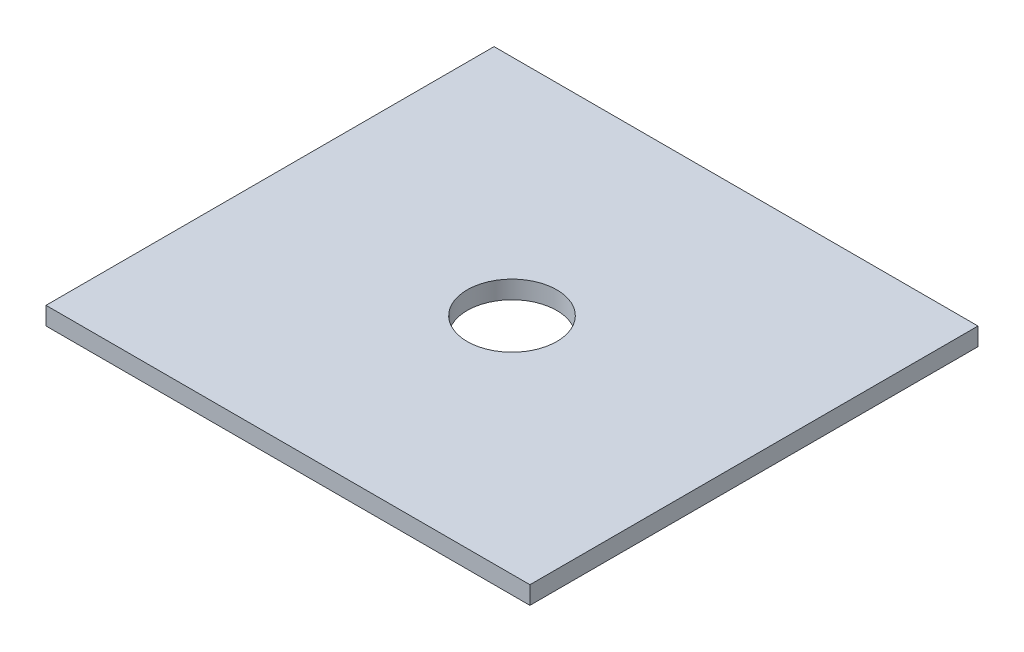
ISO-10303-21;
HEADER;
FILE_DESCRIPTION(('STEP AP214'),'2;1');
FILE_NAME('part.step','',(''),(''),'','','');
FILE_SCHEMA(('AUTOMOTIVE_DESIGN { 1 0 10303 214 1 1 1 1 }'));
ENDSEC;
DATA;
#1=APPLICATION_CONTEXT('core data for automotive mechanical design processes');
#2=APPLICATION_PROTOCOL_DEFINITION('international standard','automotive_design',2000,#1);
#3=PRODUCT_CONTEXT('',#1,'mechanical');
#4=PRODUCT('Part','Part','',(#3));
#5=PRODUCT_RELATED_PRODUCT_CATEGORY('part','',(#4));
#6=PRODUCT_DEFINITION_FORMATION('','',#4);
#7=PRODUCT_DEFINITION_CONTEXT('part definition',#1,'design');
#8=PRODUCT_DEFINITION('design','',#6,#7);
#9=PRODUCT_DEFINITION_SHAPE('','',#8);
#10=(LENGTH_UNIT() NAMED_UNIT(*) SI_UNIT(.MILLI.,.METRE.));
#11=(NAMED_UNIT(*) PLANE_ANGLE_UNIT() SI_UNIT($,.RADIAN.));
#12=(NAMED_UNIT(*) SI_UNIT($,.STERADIAN.) SOLID_ANGLE_UNIT());
#13=UNCERTAINTY_MEASURE_WITH_UNIT(LENGTH_MEASURE(1.E-05),#10,'distance_accuracy_value','');
#14=(GEOMETRIC_REPRESENTATION_CONTEXT(3) GLOBAL_UNCERTAINTY_ASSIGNED_CONTEXT((#13)) GLOBAL_UNIT_ASSIGNED_CONTEXT((#10,
#11,#12)) REPRESENTATION_CONTEXT('',''));
#15=CARTESIAN_POINT('',(0.,0.,0.));
#16=DIRECTION('',(0.,0.,1.));
#17=DIRECTION('',(1.,0.,0.));
#18=AXIS2_PLACEMENT_3D('',#15,#16,#17);
#19=CARTESIAN_POINT('',(0.,2.,0.));
#20=DIRECTION('',(0.,-1.,0.));
#21=DIRECTION('',(0.,0.,-1.));
#22=AXIS2_PLACEMENT_3D('',#19,#20,#21);
#23=PLANE('',#22);
#24=DIRECTION('',(0.,0.,1.));
#25=VECTOR('',#24,1.);
#26=CARTESIAN_POINT('',(0.,2.,0.));
#27=LINE('',#26,#25);
#28=CARTESIAN_POINT('',(0.,2.,-50.));
#29=VERTEX_POINT('',#28);
#30=CARTESIAN_POINT('',(0.,2.,0.));
#31=VERTEX_POINT('',#30);
#32=EDGE_CURVE('E85',#29,#31,#27,.T.);
#33=ORIENTED_EDGE('',*,*,#32,.T.);
#34=DIRECTION('',(1.,0.,0.));
#35=VECTOR('',#34,1.);
#36=CARTESIAN_POINT('',(0.,2.,0.));
#37=LINE('',#36,#35);
#38=CARTESIAN_POINT('',(54.,2.,0.));
#39=VERTEX_POINT('',#38);
#40=EDGE_CURVE('E80',#31,#39,#37,.T.);
#41=ORIENTED_EDGE('',*,*,#40,.T.);
#42=DIRECTION('',(0.,0.,-1.));
#43=VECTOR('',#42,1.);
#44=CARTESIAN_POINT('',(54.,2.,0.));
#45=LINE('',#44,#43);
#46=CARTESIAN_POINT('',(54.,2.,-50.));
#47=VERTEX_POINT('',#46);
#48=EDGE_CURVE('E83',#39,#47,#45,.T.);
#49=ORIENTED_EDGE('',*,*,#48,.T.);
#50=DIRECTION('',(-1.,0.,0.));
#51=VECTOR('',#50,1.);
#52=CARTESIAN_POINT('',(0.,2.,-50.));
#53=LINE('',#52,#51);
#54=EDGE_CURVE('E50',#47,#29,#53,.T.);
#55=ORIENTED_EDGE('',*,*,#54,.T.);
#56=EDGE_LOOP('',(#33,#41,#49,#55));
#57=FACE_BOUND('',#56,.T.);
#58=CARTESIAN_POINT('',(27.,2.,-25.));
#59=DIRECTION('',(0.,1.,0.));
#60=DIRECTION('',(0.,0.,1.));
#61=AXIS2_PLACEMENT_3D('',#58,#59,#60);
#62=CIRCLE('',#61,5.);
#63=CARTESIAN_POINT('',(27.,2.,-20.));
#64=VERTEX_POINT('',#63);
#65=EDGE_CURVE('E100',#64,#64,#62,.T.);
#66=ORIENTED_EDGE('',*,*,#65,.F.);
#67=EDGE_LOOP('',(#66));
#68=FACE_BOUND('',#67,.T.);
#69=ADVANCED_FACE('F33',(#57,#68),#23,.F.);
#70=CARTESIAN_POINT('',(0.,0.,0.));
#71=DIRECTION('',(0.,-1.,0.));
#72=DIRECTION('',(0.,0.,-1.));
#73=AXIS2_PLACEMENT_3D('',#70,#71,#72);
#74=PLANE('',#73);
#75=DIRECTION('',(0.,0.,1.));
#76=VECTOR('',#75,1.);
#77=CARTESIAN_POINT('',(0.,0.,0.));
#78=LINE('',#77,#76);
#79=CARTESIAN_POINT('',(0.,0.,-50.));
#80=VERTEX_POINT('',#79);
#81=CARTESIAN_POINT('',(0.,0.,0.));
#82=VERTEX_POINT('',#81);
#83=EDGE_CURVE('E97',#80,#82,#78,.T.);
#84=ORIENTED_EDGE('',*,*,#83,.F.);
#85=DIRECTION('',(-1.,0.,0.));
#86=VECTOR('',#85,1.);
#87=CARTESIAN_POINT('',(0.,0.,-50.));
#88=LINE('',#87,#86);
#89=CARTESIAN_POINT('',(54.,0.,-50.));
#90=VERTEX_POINT('',#89);
#91=EDGE_CURVE('E73',#90,#80,#88,.T.);
#92=ORIENTED_EDGE('',*,*,#91,.F.);
#93=DIRECTION('',(0.,0.,-1.));
#94=VECTOR('',#93,1.);
#95=CARTESIAN_POINT('',(54.,0.,0.));
#96=LINE('',#95,#94);
#97=CARTESIAN_POINT('',(54.,0.,0.));
#98=VERTEX_POINT('',#97);
#99=EDGE_CURVE('E67',#98,#90,#96,.T.);
#100=ORIENTED_EDGE('',*,*,#99,.F.);
#101=DIRECTION('',(1.,0.,0.));
#102=VECTOR('',#101,1.);
#103=CARTESIAN_POINT('',(0.,0.,0.));
#104=LINE('',#103,#102);
#105=EDGE_CURVE('E89',#82,#98,#104,.T.);
#106=ORIENTED_EDGE('',*,*,#105,.F.);
#107=EDGE_LOOP('',(#84,#92,#100,#106));
#108=FACE_BOUND('',#107,.T.);
#109=CARTESIAN_POINT('',(27.,0.,-25.));
#110=DIRECTION('',(0.,1.,0.));
#111=DIRECTION('',(0.,0.,1.));
#112=AXIS2_PLACEMENT_3D('',#109,#110,#111);
#113=CIRCLE('',#112,5.);
#114=CARTESIAN_POINT('',(27.,0.,-20.));
#115=VERTEX_POINT('',#114);
#116=EDGE_CURVE('E112',#115,#115,#113,.T.);
#117=ORIENTED_EDGE('',*,*,#116,.T.);
#118=EDGE_LOOP('',(#117));
#119=FACE_BOUND('',#118,.T.);
#120=ADVANCED_FACE('F108',(#108,#119),#74,.T.);
#121=CARTESIAN_POINT('',(0.,2.,0.));
#122=DIRECTION('',(1.,0.,0.));
#123=DIRECTION('',(0.,0.,-1.));
#124=AXIS2_PLACEMENT_3D('',#121,#122,#123);
#125=PLANE('',#124);
#126=ORIENTED_EDGE('',*,*,#83,.T.);
#127=DIRECTION('',(0.,-1.,0.));
#128=VECTOR('',#127,1.);
#129=CARTESIAN_POINT('',(0.,2.,0.));
#130=LINE('',#129,#128);
#131=EDGE_CURVE('E11',#31,#82,#130,.T.);
#132=ORIENTED_EDGE('',*,*,#131,.F.);
#133=ORIENTED_EDGE('',*,*,#32,.F.);
#134=DIRECTION('',(0.,-1.,0.));
#135=VECTOR('',#134,1.);
#136=CARTESIAN_POINT('',(0.,2.,-50.));
#137=LINE('',#136,#135);
#138=EDGE_CURVE('E93',#29,#80,#137,.T.);
#139=ORIENTED_EDGE('',*,*,#138,.T.);
#140=EDGE_LOOP('',(#126,#132,#133,#139));
#141=FACE_BOUND('',#140,.T.);
#142=ADVANCED_FACE('F35',(#141),#125,.F.);
#143=CARTESIAN_POINT('',(0.,2.,0.));
#144=DIRECTION('',(0.,0.,-1.));
#145=DIRECTION('',(-1.,0.,0.));
#146=AXIS2_PLACEMENT_3D('',#143,#144,#145);
#147=PLANE('',#146);
#148=ORIENTED_EDGE('',*,*,#105,.T.);
#149=DIRECTION('',(0.,-1.,0.));
#150=VECTOR('',#149,1.);
#151=CARTESIAN_POINT('',(54.,2.,0.));
#152=LINE('',#151,#150);
#153=EDGE_CURVE('E42',#39,#98,#152,.T.);
#154=ORIENTED_EDGE('',*,*,#153,.F.);
#155=ORIENTED_EDGE('',*,*,#40,.F.);
#156=ORIENTED_EDGE('',*,*,#131,.T.);
#157=EDGE_LOOP('',(#148,#154,#155,#156));
#158=FACE_BOUND('',#157,.T.);
#159=ADVANCED_FACE('F88',(#158),#147,.F.);
#160=CARTESIAN_POINT('',(54.,2.,0.));
#161=DIRECTION('',(-1.,0.,0.));
#162=DIRECTION('',(0.,0.,1.));
#163=AXIS2_PLACEMENT_3D('',#160,#161,#162);
#164=PLANE('',#163);
#165=ORIENTED_EDGE('',*,*,#99,.T.);
#166=DIRECTION('',(0.,-1.,0.));
#167=VECTOR('',#166,1.);
#168=CARTESIAN_POINT('',(54.,2.,-50.));
#169=LINE('',#168,#167);
#170=EDGE_CURVE('E90',#47,#90,#169,.T.);
#171=ORIENTED_EDGE('',*,*,#170,.F.);
#172=ORIENTED_EDGE('',*,*,#48,.F.);
#173=ORIENTED_EDGE('',*,*,#153,.T.);
#174=EDGE_LOOP('',(#165,#171,#172,#173));
#175=FACE_BOUND('',#174,.T.);
#176=ADVANCED_FACE('F91',(#175),#164,.F.);
#177=CARTESIAN_POINT('',(0.,2.,-50.));
#178=DIRECTION('',(0.,0.,1.));
#179=DIRECTION('',(1.,0.,0.));
#180=AXIS2_PLACEMENT_3D('',#177,#178,#179);
#181=PLANE('',#180);
#182=ORIENTED_EDGE('',*,*,#91,.T.);
#183=ORIENTED_EDGE('',*,*,#138,.F.);
#184=ORIENTED_EDGE('',*,*,#54,.F.);
#185=ORIENTED_EDGE('',*,*,#170,.T.);
#186=EDGE_LOOP('',(#182,#183,#184,#185));
#187=FACE_BOUND('',#186,.T.);
#188=ADVANCED_FACE('F105',(#187),#181,.F.);
#189=CARTESIAN_POINT('',(27.,2.,-25.));
#190=DIRECTION('',(0.,-1.,0.));
#191=DIRECTION('',(0.,0.,-1.));
#192=AXIS2_PLACEMENT_3D('',#189,#190,#191);
#193=CYLINDRICAL_SURFACE('',#192,5.);
#194=ORIENTED_EDGE('',*,*,#65,.T.);
#195=EDGE_LOOP('',(#194));
#196=FACE_BOUND('',#195,.T.);
#197=ORIENTED_EDGE('',*,*,#116,.F.);
#198=EDGE_LOOP('',(#197));
#199=FACE_BOUND('',#198,.T.);
#200=ADVANCED_FACE('F118',(#196,#199),#193,.F.);
#201=CLOSED_SHELL('',(#69,#120,#142,#159,#176,#188,#200));
#202=MANIFOLD_SOLID_BREP('B2',#201);
#203=ADVANCED_BREP_SHAPE_REPRESENTATION('',(#18,#202),#14);
#204=SHAPE_DEFINITION_REPRESENTATION(#9,#203);
ENDSEC;
END-ISO-10303-21;
